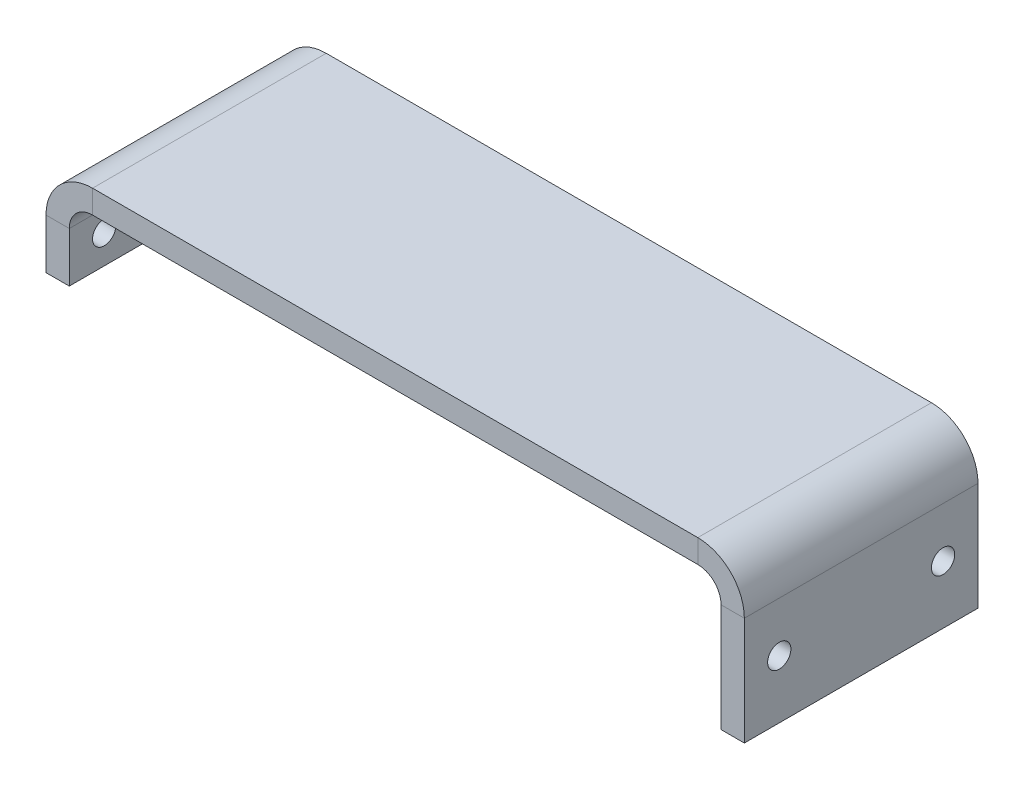
ISO-10303-21;
HEADER;
FILE_DESCRIPTION(('STEP AP214'),'2;1');
FILE_NAME('part.step','',(''),(''),'','','');
FILE_SCHEMA(('AUTOMOTIVE_DESIGN { 1 0 10303 214 1 1 1 1 }'));
ENDSEC;
DATA;
#1=APPLICATION_CONTEXT('core data for automotive mechanical design processes');
#2=APPLICATION_PROTOCOL_DEFINITION('international standard','automotive_design',2000,#1);
#3=PRODUCT_CONTEXT('',#1,'mechanical');
#4=PRODUCT('Part','Part','',(#3));
#5=PRODUCT_RELATED_PRODUCT_CATEGORY('part','',(#4));
#6=PRODUCT_DEFINITION_FORMATION('','',#4);
#7=PRODUCT_DEFINITION_CONTEXT('part definition',#1,'design');
#8=PRODUCT_DEFINITION('design','',#6,#7);
#9=PRODUCT_DEFINITION_SHAPE('','',#8);
#10=(LENGTH_UNIT() NAMED_UNIT(*) SI_UNIT(.MILLI.,.METRE.));
#11=(NAMED_UNIT(*) PLANE_ANGLE_UNIT() SI_UNIT($,.RADIAN.));
#12=(NAMED_UNIT(*) SI_UNIT($,.STERADIAN.) SOLID_ANGLE_UNIT());
#13=UNCERTAINTY_MEASURE_WITH_UNIT(LENGTH_MEASURE(1.E-05),#10,'distance_accuracy_value','');
#14=(GEOMETRIC_REPRESENTATION_CONTEXT(3) GLOBAL_UNCERTAINTY_ASSIGNED_CONTEXT((#13)) GLOBAL_UNIT_ASSIGNED_CONTEXT((#10,
#11,#12)) REPRESENTATION_CONTEXT('',''));
#15=CARTESIAN_POINT('',(0.,0.,0.));
#16=DIRECTION('',(0.,0.,1.));
#17=DIRECTION('',(1.,0.,0.));
#18=AXIS2_PLACEMENT_3D('',#15,#16,#17);
#19=CARTESIAN_POINT('',(-75.,-4.,20.075));
#20=DIRECTION('',(0.,0.,1.));
#21=DIRECTION('',(1.,0.,0.));
#22=AXIS2_PLACEMENT_3D('',#19,#20,#21);
#23=PLANE('',#22);
#24=DIRECTION('',(1.,0.,0.));
#25=VECTOR('',#24,1.);
#26=CARTESIAN_POINT('',(-75.,-4.,20.075));
#27=LINE('',#26,#25);
#28=CARTESIAN_POINT('',(-57.,-4.,20.075));
#29=VERTEX_POINT('',#28);
#30=CARTESIAN_POINT('',(47.,-4.,20.075));
#31=VERTEX_POINT('',#30);
#32=EDGE_CURVE('E218',#29,#31,#27,.T.);
#33=ORIENTED_EDGE('',*,*,#32,.T.);
#34=DIRECTION('',(0.,1.,0.));
#35=VECTOR('',#34,1.);
#36=CARTESIAN_POINT('',(47.,-4.,20.075));
#37=LINE('',#36,#35);
#38=CARTESIAN_POINT('',(47.,0.,20.075));
#39=VERTEX_POINT('',#38);
#40=EDGE_CURVE('E12',#31,#39,#37,.T.);
#41=ORIENTED_EDGE('',*,*,#40,.T.);
#42=DIRECTION('',(1.,0.,0.));
#43=VECTOR('',#42,1.);
#44=CARTESIAN_POINT('',(-75.,0.,20.075));
#45=LINE('',#44,#43);
#46=CARTESIAN_POINT('',(-57.,0.,20.075));
#47=VERTEX_POINT('',#46);
#48=EDGE_CURVE('E202',#47,#39,#45,.T.);
#49=ORIENTED_EDGE('',*,*,#48,.F.);
#50=DIRECTION('',(0.,1.,0.));
#51=VECTOR('',#50,1.);
#52=CARTESIAN_POINT('',(-57.,-4.,20.075));
#53=LINE('',#52,#51);
#54=EDGE_CURVE('E207',#29,#47,#53,.T.);
#55=ORIENTED_EDGE('',*,*,#54,.F.);
#56=EDGE_LOOP('',(#33,#41,#49,#55));
#57=FACE_BOUND('',#56,.T.);
#58=ADVANCED_FACE('F44',(#57),#23,.T.);
#59=CARTESIAN_POINT('',(-75.,-4.,-20.075));
#60=DIRECTION('',(0.,0.,-1.));
#61=DIRECTION('',(-1.,0.,0.));
#62=AXIS2_PLACEMENT_3D('',#59,#60,#61);
#63=PLANE('',#62);
#64=DIRECTION('',(-1.,0.,0.));
#65=VECTOR('',#64,1.);
#66=CARTESIAN_POINT('',(-75.,0.,-20.075));
#67=LINE('',#66,#65);
#68=CARTESIAN_POINT('',(47.,0.,-20.075));
#69=VERTEX_POINT('',#68);
#70=CARTESIAN_POINT('',(-57.,0.,-20.075));
#71=VERTEX_POINT('',#70);
#72=EDGE_CURVE('E203',#69,#71,#67,.T.);
#73=ORIENTED_EDGE('',*,*,#72,.F.);
#74=DIRECTION('',(0.,-1.,0.));
#75=VECTOR('',#74,1.);
#76=CARTESIAN_POINT('',(47.,-4.,-20.075));
#77=LINE('',#76,#75);
#78=CARTESIAN_POINT('',(47.,-4.,-20.075));
#79=VERTEX_POINT('',#78);
#80=EDGE_CURVE('E259',#69,#79,#77,.T.);
#81=ORIENTED_EDGE('',*,*,#80,.T.);
#82=DIRECTION('',(-1.,0.,0.));
#83=VECTOR('',#82,1.);
#84=CARTESIAN_POINT('',(-75.,-4.,-20.075));
#85=LINE('',#84,#83);
#86=CARTESIAN_POINT('',(-57.,-4.,-20.075));
#87=VERTEX_POINT('',#86);
#88=EDGE_CURVE('E47',#79,#87,#85,.T.);
#89=ORIENTED_EDGE('',*,*,#88,.T.);
#90=DIRECTION('',(0.,-1.,0.));
#91=VECTOR('',#90,1.);
#92=CARTESIAN_POINT('',(-57.,-4.,-20.075));
#93=LINE('',#92,#91);
#94=EDGE_CURVE('E204',#71,#87,#93,.T.);
#95=ORIENTED_EDGE('',*,*,#94,.F.);
#96=EDGE_LOOP('',(#73,#81,#89,#95));
#97=FACE_BOUND('',#96,.T.);
#98=ADVANCED_FACE('F272',(#97),#63,.T.);
#99=CARTESIAN_POINT('',(0.,-4.,0.));
#100=DIRECTION('',(0.,-1.,0.));
#101=DIRECTION('',(0.,0.,-1.));
#102=AXIS2_PLACEMENT_3D('',#99,#100,#101);
#103=PLANE('',#102);
#104=ORIENTED_EDGE('',*,*,#88,.F.);
#105=DIRECTION('',(0.,0.,1.));
#106=VECTOR('',#105,1.);
#107=CARTESIAN_POINT('',(47.,-4.,0.));
#108=LINE('',#107,#106);
#109=EDGE_CURVE('E250',#79,#31,#108,.T.);
#110=ORIENTED_EDGE('',*,*,#109,.T.);
#111=ORIENTED_EDGE('',*,*,#32,.F.);
#112=DIRECTION('',(0.,0.,1.));
#113=VECTOR('',#112,1.);
#114=CARTESIAN_POINT('',(-57.,-4.,0.));
#115=LINE('',#114,#113);
#116=EDGE_CURVE('E194',#87,#29,#115,.T.);
#117=ORIENTED_EDGE('',*,*,#116,.F.);
#118=EDGE_LOOP('',(#104,#110,#111,#117));
#119=FACE_BOUND('',#118,.T.);
#120=ADVANCED_FACE('F275',(#119),#103,.T.);
#121=CARTESIAN_POINT('',(-61.,-16.5752220392306,20.075));
#122=DIRECTION('',(0.,0.,1.));
#123=DIRECTION('',(0.,1.,0.));
#124=AXIS2_PLACEMENT_3D('',#121,#122,#123);
#125=PLANE('',#124);
#126=DIRECTION('',(0.,1.,0.));
#127=VECTOR('',#126,1.);
#128=CARTESIAN_POINT('',(-61.,-16.5752220392306,20.075));
#129=LINE('',#128,#127);
#130=CARTESIAN_POINT('',(-61.,-16.5752220392306,20.075));
#131=VERTEX_POINT('',#130);
#132=CARTESIAN_POINT('',(-61.,-8.00000000000001,20.075));
#133=VERTEX_POINT('',#132);
#134=EDGE_CURVE('E228',#131,#133,#129,.T.);
#135=ORIENTED_EDGE('',*,*,#134,.T.);
#136=DIRECTION('',(-1.,0.,0.));
#137=VECTOR('',#136,1.);
#138=CARTESIAN_POINT('',(-61.,-8.00000000000001,20.075));
#139=LINE('',#138,#137);
#140=CARTESIAN_POINT('',(-65.,-8.00000000000002,20.075));
#141=VERTEX_POINT('',#140);
#142=EDGE_CURVE('E247',#133,#141,#139,.T.);
#143=ORIENTED_EDGE('',*,*,#142,.T.);
#144=DIRECTION('',(0.,1.,0.));
#145=VECTOR('',#144,1.);
#146=CARTESIAN_POINT('',(-65.,-16.5752220392306,20.075));
#147=LINE('',#146,#145);
#148=CARTESIAN_POINT('',(-65.,-16.5752220392306,20.075));
#149=VERTEX_POINT('',#148);
#150=EDGE_CURVE('E233',#149,#141,#147,.T.);
#151=ORIENTED_EDGE('',*,*,#150,.F.);
#152=DIRECTION('',(-1.,0.,0.));
#153=VECTOR('',#152,1.);
#154=CARTESIAN_POINT('',(-61.,-16.5752220392306,20.075));
#155=LINE('',#154,#153);
#156=EDGE_CURVE('E234',#131,#149,#155,.T.);
#157=ORIENTED_EDGE('',*,*,#156,.F.);
#158=EDGE_LOOP('',(#135,#143,#151,#157));
#159=FACE_BOUND('',#158,.T.);
#160=ADVANCED_FACE('F288',(#159),#125,.T.);
#161=CARTESIAN_POINT('',(-61.,-16.5752220392306,-20.075));
#162=DIRECTION('',(0.,0.,-1.));
#163=DIRECTION('',(0.,-1.,0.));
#164=AXIS2_PLACEMENT_3D('',#161,#162,#163);
#165=PLANE('',#164);
#166=DIRECTION('',(0.,-1.,0.));
#167=VECTOR('',#166,1.);
#168=CARTESIAN_POINT('',(-65.,-16.5752220392306,-20.075));
#169=LINE('',#168,#167);
#170=CARTESIAN_POINT('',(-65.,-8.00000000000002,-20.075));
#171=VERTEX_POINT('',#170);
#172=CARTESIAN_POINT('',(-65.,-16.5752220392306,-20.075));
#173=VERTEX_POINT('',#172);
#174=EDGE_CURVE('E222',#171,#173,#169,.T.);
#175=ORIENTED_EDGE('',*,*,#174,.F.);
#176=DIRECTION('',(1.,0.,0.));
#177=VECTOR('',#176,1.);
#178=CARTESIAN_POINT('',(-61.,-8.00000000000001,-20.075));
#179=LINE('',#178,#177);
#180=CARTESIAN_POINT('',(-61.,-8.00000000000001,-20.075));
#181=VERTEX_POINT('',#180);
#182=EDGE_CURVE('E242',#171,#181,#179,.T.);
#183=ORIENTED_EDGE('',*,*,#182,.T.);
#184=DIRECTION('',(0.,-1.,0.));
#185=VECTOR('',#184,1.);
#186=CARTESIAN_POINT('',(-61.,-16.5752220392306,-20.075));
#187=LINE('',#186,#185);
#188=CARTESIAN_POINT('',(-61.,-16.5752220392306,-20.075));
#189=VERTEX_POINT('',#188);
#190=EDGE_CURVE('E229',#181,#189,#187,.T.);
#191=ORIENTED_EDGE('',*,*,#190,.T.);
#192=DIRECTION('',(-1.,0.,0.));
#193=VECTOR('',#192,1.);
#194=CARTESIAN_POINT('',(-61.,-16.5752220392306,-20.075));
#195=LINE('',#194,#193);
#196=EDGE_CURVE('E237',#189,#173,#195,.T.);
#197=ORIENTED_EDGE('',*,*,#196,.T.);
#198=EDGE_LOOP('',(#175,#183,#191,#197));
#199=FACE_BOUND('',#198,.T.);
#200=ADVANCED_FACE('F296',(#199),#165,.T.);
#201=CARTESIAN_POINT('',(-61.0000000000002,58.4247779607694,0.));
#202=DIRECTION('',(1.,0.,0.));
#203=DIRECTION('',(0.,0.,-1.));
#204=AXIS2_PLACEMENT_3D('',#201,#202,#203);
#205=PLANE('',#204);
#206=CARTESIAN_POINT('',(-61.,-11.5752220392306,-14.075));
#207=DIRECTION('',(-1.,0.,0.));
#208=DIRECTION('',(0.,0.,1.));
#209=AXIS2_PLACEMENT_3D('',#206,#207,#208);
#210=CIRCLE('',#209,2.);
#211=CARTESIAN_POINT('',(-61.,-11.5752220392306,-12.075));
#212=VERTEX_POINT('',#211);
#213=EDGE_CURVE('E219',#212,#212,#210,.T.);
#214=ORIENTED_EDGE('',*,*,#213,.T.);
#215=EDGE_LOOP('',(#214));
#216=FACE_BOUND('',#215,.T.);
#217=CARTESIAN_POINT('',(-61.,-11.5752220392306,14.075));
#218=DIRECTION('',(-1.,0.,0.));
#219=DIRECTION('',(0.,0.,-1.));
#220=AXIS2_PLACEMENT_3D('',#217,#218,#219);
#221=CIRCLE('',#220,2.);
#222=CARTESIAN_POINT('',(-61.,-11.5752220392306,12.075));
#223=VERTEX_POINT('',#222);
#224=EDGE_CURVE('E211',#223,#223,#221,.T.);
#225=ORIENTED_EDGE('',*,*,#224,.T.);
#226=EDGE_LOOP('',(#225));
#227=FACE_BOUND('',#226,.T.);
#228=ORIENTED_EDGE('',*,*,#190,.F.);
#229=DIRECTION('',(0.,0.,1.));
#230=VECTOR('',#229,1.);
#231=CARTESIAN_POINT('',(-61.,-8.00000000000001,0.));
#232=LINE('',#231,#230);
#233=EDGE_CURVE('E236',#181,#133,#232,.T.);
#234=ORIENTED_EDGE('',*,*,#233,.T.);
#235=ORIENTED_EDGE('',*,*,#134,.F.);
#236=DIRECTION('',(0.,0.,1.));
#237=VECTOR('',#236,1.);
#238=CARTESIAN_POINT('',(-61.,-16.5752220392306,20.075));
#239=LINE('',#238,#237);
#240=EDGE_CURVE('E225',#189,#131,#239,.T.);
#241=ORIENTED_EDGE('',*,*,#240,.F.);
#242=EDGE_LOOP('',(#228,#234,#235,#241));
#243=FACE_BOUND('',#242,.T.);
#244=ADVANCED_FACE('F285',(#216,#227,#243),#205,.T.);
#245=CARTESIAN_POINT('',(-61.,-16.5752220392306,20.075));
#246=DIRECTION('',(0.,-1.,0.));
#247=DIRECTION('',(0.,0.,1.));
#248=AXIS2_PLACEMENT_3D('',#245,#246,#247);
#249=PLANE('',#248);
#250=DIRECTION('',(0.,0.,1.));
#251=VECTOR('',#250,1.);
#252=CARTESIAN_POINT('',(-65.,-16.5752220392306,20.075));
#253=LINE('',#252,#251);
#254=EDGE_CURVE('E230',#173,#149,#253,.T.);
#255=ORIENTED_EDGE('',*,*,#254,.F.);
#256=ORIENTED_EDGE('',*,*,#196,.F.);
#257=ORIENTED_EDGE('',*,*,#240,.T.);
#258=ORIENTED_EDGE('',*,*,#156,.T.);
#259=EDGE_LOOP('',(#255,#256,#257,#258));
#260=FACE_BOUND('',#259,.T.);
#261=ADVANCED_FACE('F293',(#260),#249,.T.);
#262=CARTESIAN_POINT('',(-65.0000000000003,58.4247779607694,0.));
#263=DIRECTION('',(1.,0.,0.));
#264=DIRECTION('',(0.,0.,-1.));
#265=AXIS2_PLACEMENT_3D('',#262,#263,#264);
#266=PLANE('',#265);
#267=DIRECTION('',(0.,0.,1.));
#268=VECTOR('',#267,1.);
#269=CARTESIAN_POINT('',(-65.,-8.00000000000003,0.));
#270=LINE('',#269,#268);
#271=EDGE_CURVE('E245',#171,#141,#270,.T.);
#272=ORIENTED_EDGE('',*,*,#271,.F.);
#273=ORIENTED_EDGE('',*,*,#174,.T.);
#274=ORIENTED_EDGE('',*,*,#254,.T.);
#275=ORIENTED_EDGE('',*,*,#150,.T.);
#276=EDGE_LOOP('',(#272,#273,#274,#275));
#277=FACE_BOUND('',#276,.T.);
#278=CARTESIAN_POINT('',(-65.,-11.5752220392306,14.075));
#279=DIRECTION('',(-1.,0.,0.));
#280=DIRECTION('',(0.,0.,-1.));
#281=AXIS2_PLACEMENT_3D('',#278,#279,#280);
#282=CIRCLE('',#281,2.);
#283=CARTESIAN_POINT('',(-65.,-11.5752220392306,12.075));
#284=VERTEX_POINT('',#283);
#285=EDGE_CURVE('E215',#284,#284,#282,.T.);
#286=ORIENTED_EDGE('',*,*,#285,.F.);
#287=EDGE_LOOP('',(#286));
#288=FACE_BOUND('',#287,.T.);
#289=CARTESIAN_POINT('',(-65.,-11.5752220392306,-14.075));
#290=DIRECTION('',(-1.,0.,0.));
#291=DIRECTION('',(0.,0.,1.));
#292=AXIS2_PLACEMENT_3D('',#289,#290,#291);
#293=CIRCLE('',#292,2.);
#294=CARTESIAN_POINT('',(-65.,-11.5752220392306,-12.075));
#295=VERTEX_POINT('',#294);
#296=EDGE_CURVE('E214',#295,#295,#293,.T.);
#297=ORIENTED_EDGE('',*,*,#296,.F.);
#298=EDGE_LOOP('',(#297));
#299=FACE_BOUND('',#298,.T.);
#300=ADVANCED_FACE('F377',(#277,#288,#299),#266,.F.);
#301=CARTESIAN_POINT('',(-61.,-11.5752220392306,-14.075));
#302=DIRECTION('',(-1.,0.,0.));
#303=DIRECTION('',(0.,0.,1.));
#304=AXIS2_PLACEMENT_3D('',#301,#302,#303);
#305=CYLINDRICAL_SURFACE('',#304,2.);
#306=ORIENTED_EDGE('',*,*,#213,.F.);
#307=EDGE_LOOP('',(#306));
#308=FACE_BOUND('',#307,.T.);
#309=ORIENTED_EDGE('',*,*,#296,.T.);
#310=EDGE_LOOP('',(#309));
#311=FACE_BOUND('',#310,.T.);
#312=ADVANCED_FACE('F371',(#308,#311),#305,.F.);
#313=CARTESIAN_POINT('',(-61.,-11.5752220392306,14.075));
#314=DIRECTION('',(-1.,0.,0.));
#315=DIRECTION('',(0.,0.,1.));
#316=AXIS2_PLACEMENT_3D('',#313,#314,#315);
#317=CYLINDRICAL_SURFACE('',#316,2.);
#318=ORIENTED_EDGE('',*,*,#224,.F.);
#319=EDGE_LOOP('',(#318));
#320=FACE_BOUND('',#319,.T.);
#321=ORIENTED_EDGE('',*,*,#285,.T.);
#322=EDGE_LOOP('',(#321));
#323=FACE_BOUND('',#322,.T.);
#324=ADVANCED_FACE('F365',(#320,#323),#317,.F.);
#325=CARTESIAN_POINT('',(0.,0.,0.));
#326=DIRECTION('',(0.,-1.,0.));
#327=DIRECTION('',(0.,0.,-1.));
#328=AXIS2_PLACEMENT_3D('',#325,#326,#327);
#329=PLANE('',#328);
#330=DIRECTION('',(0.,0.,1.));
#331=VECTOR('',#330,1.);
#332=CARTESIAN_POINT('',(47.,0.,0.));
#333=LINE('',#332,#331);
#334=EDGE_CURVE('E52',#69,#39,#333,.T.);
#335=ORIENTED_EDGE('',*,*,#334,.F.);
#336=ORIENTED_EDGE('',*,*,#72,.T.);
#337=DIRECTION('',(0.,0.,1.));
#338=VECTOR('',#337,1.);
#339=CARTESIAN_POINT('',(-57.,0.,0.));
#340=LINE('',#339,#338);
#341=EDGE_CURVE('E199',#71,#47,#340,.T.);
#342=ORIENTED_EDGE('',*,*,#341,.T.);
#343=ORIENTED_EDGE('',*,*,#48,.T.);
#344=EDGE_LOOP('',(#335,#336,#342,#343));
#345=FACE_BOUND('',#344,.T.);
#346=ADVANCED_FACE('F301',(#345),#329,.F.);
#347=CARTESIAN_POINT('',(-57.,-8.,-20.075));
#348=DIRECTION('',(0.,0.,1.));
#349=DIRECTION('',(1.,0.,0.));
#350=AXIS2_PLACEMENT_3D('',#347,#348,#349);
#351=PLANE('',#350);
#352=ORIENTED_EDGE('',*,*,#182,.F.);
#353=CARTESIAN_POINT('',(-57.,-8.,-20.075));
#354=DIRECTION('',(0.,0.,-1.));
#355=DIRECTION('',(-1.,0.,0.));
#356=AXIS2_PLACEMENT_3D('',#353,#354,#355);
#357=CIRCLE('',#356,8.);
#358=EDGE_CURVE('E185',#171,#71,#357,.T.);
#359=ORIENTED_EDGE('',*,*,#358,.T.);
#360=ORIENTED_EDGE('',*,*,#94,.T.);
#361=CARTESIAN_POINT('',(-57.,-8.,-20.075));
#362=DIRECTION('',(0.,0.,-1.));
#363=DIRECTION('',(1.,0.,0.));
#364=AXIS2_PLACEMENT_3D('',#361,#362,#363);
#365=CIRCLE('',#364,4.);
#366=EDGE_CURVE('E189',#181,#87,#365,.T.);
#367=ORIENTED_EDGE('',*,*,#366,.F.);
#368=EDGE_LOOP('',(#352,#359,#360,#367));
#369=FACE_BOUND('',#368,.T.);
#370=ADVANCED_FACE('F279',(#369),#351,.F.);
#371=CARTESIAN_POINT('',(-57.,-8.,20.075));
#372=DIRECTION('',(0.,0.,-1.));
#373=DIRECTION('',(-1.,0.,0.));
#374=AXIS2_PLACEMENT_3D('',#371,#372,#373);
#375=PLANE('',#374);
#376=CARTESIAN_POINT('',(-57.,-8.,20.075));
#377=DIRECTION('',(0.,0.,-1.));
#378=DIRECTION('',(-1.,0.,0.));
#379=AXIS2_PLACEMENT_3D('',#376,#377,#378);
#380=CIRCLE('',#379,8.);
#381=EDGE_CURVE('E192',#47,#141,#380,.F.);
#382=ORIENTED_EDGE('',*,*,#381,.T.);
#383=ORIENTED_EDGE('',*,*,#142,.F.);
#384=CARTESIAN_POINT('',(-57.,-8.,20.075));
#385=DIRECTION('',(0.,0.,1.));
#386=DIRECTION('',(-1.,0.,0.));
#387=AXIS2_PLACEMENT_3D('',#384,#385,#386);
#388=CIRCLE('',#387,4.);
#389=EDGE_CURVE('E67',#29,#133,#388,.T.);
#390=ORIENTED_EDGE('',*,*,#389,.F.);
#391=ORIENTED_EDGE('',*,*,#54,.T.);
#392=EDGE_LOOP('',(#382,#383,#390,#391));
#393=FACE_BOUND('',#392,.T.);
#394=ADVANCED_FACE('F303',(#393),#375,.F.);
#395=CARTESIAN_POINT('',(-57.,-8.,41.4348758850537));
#396=DIRECTION('',(0.,0.,-1.));
#397=DIRECTION('',(-1.,0.,0.));
#398=AXIS2_PLACEMENT_3D('',#395,#396,#397);
#399=CYLINDRICAL_SURFACE('',#398,4.);
#400=ORIENTED_EDGE('',*,*,#116,.T.);
#401=ORIENTED_EDGE('',*,*,#389,.T.);
#402=ORIENTED_EDGE('',*,*,#233,.F.);
#403=ORIENTED_EDGE('',*,*,#366,.T.);
#404=EDGE_LOOP('',(#400,#401,#402,#403));
#405=FACE_BOUND('',#404,.T.);
#406=ADVANCED_FACE('F282',(#405),#399,.F.);
#407=CARTESIAN_POINT('',(-57.,-8.,41.4348758850537));
#408=DIRECTION('',(0.,0.,-1.));
#409=DIRECTION('',(-1.,0.,0.));
#410=AXIS2_PLACEMENT_3D('',#407,#408,#409);
#411=CYLINDRICAL_SURFACE('',#410,8.);
#412=ORIENTED_EDGE('',*,*,#341,.F.);
#413=ORIENTED_EDGE('',*,*,#358,.F.);
#414=ORIENTED_EDGE('',*,*,#271,.T.);
#415=ORIENTED_EDGE('',*,*,#381,.F.);
#416=EDGE_LOOP('',(#412,#413,#414,#415));
#417=FACE_BOUND('',#416,.T.);
#418=ADVANCED_FACE('F299',(#417),#411,.T.);
#419=CARTESIAN_POINT('',(47.,-8.,-20.075));
#420=DIRECTION('',(0.,0.,1.));
#421=DIRECTION('',(1.,0.,0.));
#422=AXIS2_PLACEMENT_3D('',#419,#420,#421);
#423=PLANE('',#422);
#424=ORIENTED_EDGE('',*,*,#80,.F.);
#425=CARTESIAN_POINT('',(47.,-8.,-20.075));
#426=DIRECTION('',(0.,0.,1.));
#427=DIRECTION('',(1.,0.,0.));
#428=AXIS2_PLACEMENT_3D('',#425,#426,#427);
#429=CIRCLE('',#428,8.);
#430=CARTESIAN_POINT('',(55.,-8.00000000000003,-20.075));
#431=VERTEX_POINT('',#430);
#432=EDGE_CURVE('E153',#69,#431,#429,.F.);
#433=ORIENTED_EDGE('',*,*,#432,.T.);
#434=DIRECTION('',(-1.,0.,0.));
#435=VECTOR('',#434,1.);
#436=CARTESIAN_POINT('',(51.,-8.00000000000001,-20.075));
#437=LINE('',#436,#435);
#438=CARTESIAN_POINT('',(51.,-8.00000000000001,-20.075));
#439=VERTEX_POINT('',#438);
#440=EDGE_CURVE('E172',#431,#439,#437,.T.);
#441=ORIENTED_EDGE('',*,*,#440,.T.);
#442=CARTESIAN_POINT('',(47.,-8.,-20.075));
#443=DIRECTION('',(0.,0.,-1.));
#444=DIRECTION('',(1.,0.,0.));
#445=AXIS2_PLACEMENT_3D('',#442,#443,#444);
#446=CIRCLE('',#445,4.);
#447=EDGE_CURVE('E178',#79,#439,#446,.T.);
#448=ORIENTED_EDGE('',*,*,#447,.F.);
#449=EDGE_LOOP('',(#424,#433,#441,#448));
#450=FACE_BOUND('',#449,.T.);
#451=ADVANCED_FACE('F320',(#450),#423,.F.);
#452=CARTESIAN_POINT('',(47.,-8.,20.075));
#453=DIRECTION('',(0.,0.,-1.));
#454=DIRECTION('',(-1.,0.,0.));
#455=AXIS2_PLACEMENT_3D('',#452,#453,#454);
#456=PLANE('',#455);
#457=DIRECTION('',(1.,0.,0.));
#458=VECTOR('',#457,1.);
#459=CARTESIAN_POINT('',(51.,-8.00000000000001,20.075));
#460=LINE('',#459,#458);
#461=CARTESIAN_POINT('',(51.,-8.00000000000002,20.075));
#462=VERTEX_POINT('',#461);
#463=CARTESIAN_POINT('',(55.,-8.00000000000003,20.075));
#464=VERTEX_POINT('',#463);
#465=EDGE_CURVE('E142',#462,#464,#460,.T.);
#466=ORIENTED_EDGE('',*,*,#465,.T.);
#467=CARTESIAN_POINT('',(47.,-8.,20.075));
#468=DIRECTION('',(0.,0.,1.));
#469=DIRECTION('',(1.,0.,0.));
#470=AXIS2_PLACEMENT_3D('',#467,#468,#469);
#471=CIRCLE('',#470,8.);
#472=EDGE_CURVE('E182',#464,#39,#471,.T.);
#473=ORIENTED_EDGE('',*,*,#472,.T.);
#474=ORIENTED_EDGE('',*,*,#40,.F.);
#475=CARTESIAN_POINT('',(47.,-8.,20.075));
#476=DIRECTION('',(0.,0.,1.));
#477=DIRECTION('',(-1.,0.,0.));
#478=AXIS2_PLACEMENT_3D('',#475,#476,#477);
#479=CIRCLE('',#478,4.);
#480=EDGE_CURVE('E181',#462,#31,#479,.T.);
#481=ORIENTED_EDGE('',*,*,#480,.F.);
#482=EDGE_LOOP('',(#466,#473,#474,#481));
#483=FACE_BOUND('',#482,.T.);
#484=ADVANCED_FACE('F307',(#483),#456,.F.);
#485=CARTESIAN_POINT('',(47.,-8.,-41.4348758850537));
#486=DIRECTION('',(0.,0.,1.));
#487=DIRECTION('',(1.,0.,0.));
#488=AXIS2_PLACEMENT_3D('',#485,#486,#487);
#489=CYLINDRICAL_SURFACE('',#488,4.);
#490=ORIENTED_EDGE('',*,*,#480,.T.);
#491=ORIENTED_EDGE('',*,*,#109,.F.);
#492=ORIENTED_EDGE('',*,*,#447,.T.);
#493=DIRECTION('',(0.,0.,1.));
#494=VECTOR('',#493,1.);
#495=CARTESIAN_POINT('',(51.,-8.00000000000001,0.));
#496=LINE('',#495,#494);
#497=EDGE_CURVE('E176',#439,#462,#496,.T.);
#498=ORIENTED_EDGE('',*,*,#497,.T.);
#499=EDGE_LOOP('',(#490,#491,#492,#498));
#500=FACE_BOUND('',#499,.T.);
#501=ADVANCED_FACE('F310',(#500),#489,.F.);
#502=CARTESIAN_POINT('',(47.,-8.,-41.4348758850537));
#503=DIRECTION('',(0.,0.,1.));
#504=DIRECTION('',(1.,0.,0.));
#505=AXIS2_PLACEMENT_3D('',#502,#503,#504);
#506=CYLINDRICAL_SURFACE('',#505,8.);
#507=ORIENTED_EDGE('',*,*,#472,.F.);
#508=DIRECTION('',(0.,0.,1.));
#509=VECTOR('',#508,1.);
#510=CARTESIAN_POINT('',(55.,-8.00000000000003,0.));
#511=LINE('',#510,#509);
#512=EDGE_CURVE('E323',#431,#464,#511,.T.);
#513=ORIENTED_EDGE('',*,*,#512,.F.);
#514=ORIENTED_EDGE('',*,*,#432,.F.);
#515=ORIENTED_EDGE('',*,*,#334,.T.);
#516=EDGE_LOOP('',(#507,#513,#514,#515));
#517=FACE_BOUND('',#516,.T.);
#518=ADVANCED_FACE('F321',(#517),#506,.T.);
#519=CARTESIAN_POINT('',(51.,-16.5752220392306,-14.075));
#520=DIRECTION('',(1.,0.,0.));
#521=DIRECTION('',(0.,0.,1.));
#522=AXIS2_PLACEMENT_3D('',#519,#520,#521);
#523=CYLINDRICAL_SURFACE('',#522,2.);
#524=CARTESIAN_POINT('',(51.,-16.5752220392306,-14.075));
#525=DIRECTION('',(1.,0.,0.));
#526=DIRECTION('',(0.,0.,1.));
#527=AXIS2_PLACEMENT_3D('',#524,#525,#526);
#528=CIRCLE('',#527,2.);
#529=CARTESIAN_POINT('',(51.,-16.5752220392306,-12.075));
#530=VERTEX_POINT('',#529);
#531=EDGE_CURVE('E317',#530,#530,#528,.T.);
#532=ORIENTED_EDGE('',*,*,#531,.F.);
#533=EDGE_LOOP('',(#532));
#534=FACE_BOUND('',#533,.T.);
#535=CARTESIAN_POINT('',(55.,-16.5752220392306,-14.075));
#536=DIRECTION('',(1.,0.,0.));
#537=DIRECTION('',(0.,0.,1.));
#538=AXIS2_PLACEMENT_3D('',#535,#536,#537);
#539=CIRCLE('',#538,2.);
#540=CARTESIAN_POINT('',(55.,-16.5752220392306,-12.075));
#541=VERTEX_POINT('',#540);
#542=EDGE_CURVE('E166',#541,#541,#539,.T.);
#543=ORIENTED_EDGE('',*,*,#542,.T.);
#544=EDGE_LOOP('',(#543));
#545=FACE_BOUND('',#544,.T.);
#546=ADVANCED_FACE('F339',(#534,#545),#523,.F.);
#547=CARTESIAN_POINT('',(51.,-16.5752220392306,14.075));
#548=DIRECTION('',(1.,0.,0.));
#549=DIRECTION('',(0.,0.,1.));
#550=AXIS2_PLACEMENT_3D('',#547,#548,#549);
#551=CYLINDRICAL_SURFACE('',#550,2.);
#552=CARTESIAN_POINT('',(51.,-16.5752220392306,14.075));
#553=DIRECTION('',(1.,0.,0.));
#554=DIRECTION('',(0.,0.,-1.));
#555=AXIS2_PLACEMENT_3D('',#552,#553,#554);
#556=CIRCLE('',#555,2.);
#557=CARTESIAN_POINT('',(51.,-16.5752220392306,12.075));
#558=VERTEX_POINT('',#557);
#559=EDGE_CURVE('E163',#558,#558,#556,.T.);
#560=ORIENTED_EDGE('',*,*,#559,.F.);
#561=EDGE_LOOP('',(#560));
#562=FACE_BOUND('',#561,.T.);
#563=CARTESIAN_POINT('',(55.,-16.5752220392306,14.075));
#564=DIRECTION('',(1.,0.,0.));
#565=DIRECTION('',(0.,0.,-1.));
#566=AXIS2_PLACEMENT_3D('',#563,#564,#565);
#567=CIRCLE('',#566,2.);
#568=CARTESIAN_POINT('',(55.,-16.5752220392306,12.075));
#569=VERTEX_POINT('',#568);
#570=EDGE_CURVE('E161',#569,#569,#567,.T.);
#571=ORIENTED_EDGE('',*,*,#570,.T.);
#572=EDGE_LOOP('',(#571));
#573=FACE_BOUND('',#572,.T.);
#574=ADVANCED_FACE('F336',(#562,#573),#551,.F.);
#575=CARTESIAN_POINT('',(50.9999999999999,-26.5752220392306,20.075));
#576=DIRECTION('',(0.,-1.,0.));
#577=DIRECTION('',(0.,0.,-1.));
#578=AXIS2_PLACEMENT_3D('',#575,#576,#577);
#579=PLANE('',#578);
#580=DIRECTION('',(0.,0.,-1.));
#581=VECTOR('',#580,1.);
#582=CARTESIAN_POINT('',(54.9999999999999,-26.5752220392306,20.075));
#583=LINE('',#582,#581);
#584=CARTESIAN_POINT('',(54.9999999999999,-26.5752220392306,20.075));
#585=VERTEX_POINT('',#584);
#586=CARTESIAN_POINT('',(55.,-26.5752220392306,-20.075));
#587=VERTEX_POINT('',#586);
#588=EDGE_CURVE('E146',#585,#587,#583,.T.);
#589=ORIENTED_EDGE('',*,*,#588,.F.);
#590=DIRECTION('',(1.,0.,0.));
#591=VECTOR('',#590,1.);
#592=CARTESIAN_POINT('',(50.9999999999999,-26.5752220392306,20.075));
#593=LINE('',#592,#591);
#594=CARTESIAN_POINT('',(50.9999999999999,-26.5752220392306,20.075));
#595=VERTEX_POINT('',#594);
#596=EDGE_CURVE('E139',#595,#585,#593,.T.);
#597=ORIENTED_EDGE('',*,*,#596,.F.);
#598=DIRECTION('',(0.,0.,-1.));
#599=VECTOR('',#598,1.);
#600=CARTESIAN_POINT('',(50.9999999999999,-26.5752220392306,20.075));
#601=LINE('',#600,#599);
#602=CARTESIAN_POINT('',(51.,-26.5752220392306,-20.075));
#603=VERTEX_POINT('',#602);
#604=EDGE_CURVE('E151',#595,#603,#601,.T.);
#605=ORIENTED_EDGE('',*,*,#604,.T.);
#606=DIRECTION('',(1.,0.,0.));
#607=VECTOR('',#606,1.);
#608=CARTESIAN_POINT('',(51.,-26.5752220392306,-20.075));
#609=LINE('',#608,#607);
#610=EDGE_CURVE('E160',#603,#587,#609,.T.);
#611=ORIENTED_EDGE('',*,*,#610,.T.);
#612=EDGE_LOOP('',(#589,#597,#605,#611));
#613=FACE_BOUND('',#612,.T.);
#614=ADVANCED_FACE('F150',(#613),#579,.T.);
#615=CARTESIAN_POINT('',(51.0000000000002,48.4247779607694,0.));
#616=DIRECTION('',(-1.,0.,0.));
#617=DIRECTION('',(0.,0.,-1.));
#618=AXIS2_PLACEMENT_3D('',#615,#616,#617);
#619=PLANE('',#618);
#620=ORIENTED_EDGE('',*,*,#497,.F.);
#621=DIRECTION('',(0.,1.,0.));
#622=VECTOR('',#621,1.);
#623=CARTESIAN_POINT('',(51.0000000000005,123.424777960769,-20.0749999999999));
#624=LINE('',#623,#622);
#625=EDGE_CURVE('E159',#603,#439,#624,.T.);
#626=ORIENTED_EDGE('',*,*,#625,.F.);
#627=ORIENTED_EDGE('',*,*,#604,.F.);
#628=DIRECTION('',(0.,-1.,0.));
#629=VECTOR('',#628,1.);
#630=CARTESIAN_POINT('',(51.0000000000005,123.424777960769,20.0750000000001));
#631=LINE('',#630,#629);
#632=EDGE_CURVE('E136',#462,#595,#631,.T.);
#633=ORIENTED_EDGE('',*,*,#632,.F.);
#634=EDGE_LOOP('',(#620,#626,#627,#633));
#635=FACE_BOUND('',#634,.T.);
#636=ORIENTED_EDGE('',*,*,#559,.T.);
#637=EDGE_LOOP('',(#636));
#638=FACE_BOUND('',#637,.T.);
#639=ORIENTED_EDGE('',*,*,#531,.T.);
#640=EDGE_LOOP('',(#639));
#641=FACE_BOUND('',#640,.T.);
#642=ADVANCED_FACE('F156',(#635,#638,#641),#619,.T.);
#643=CARTESIAN_POINT('',(51.0000000000005,123.424777960769,-20.0749999999999));
#644=DIRECTION('',(0.,0.,-1.));
#645=DIRECTION('',(0.,1.,0.));
#646=AXIS2_PLACEMENT_3D('',#643,#644,#645);
#647=PLANE('',#646);
#648=ORIENTED_EDGE('',*,*,#440,.F.);
#649=DIRECTION('',(0.,1.,0.));
#650=VECTOR('',#649,1.);
#651=CARTESIAN_POINT('',(55.0000000000005,123.424777960769,-20.0749999999999));
#652=LINE('',#651,#650);
#653=EDGE_CURVE('E316',#587,#431,#652,.T.);
#654=ORIENTED_EDGE('',*,*,#653,.F.);
#655=ORIENTED_EDGE('',*,*,#610,.F.);
#656=ORIENTED_EDGE('',*,*,#625,.T.);
#657=EDGE_LOOP('',(#648,#654,#655,#656));
#658=FACE_BOUND('',#657,.T.);
#659=ADVANCED_FACE('F313',(#658),#647,.T.);
#660=CARTESIAN_POINT('',(55.0000000000002,48.4247779607694,0.));
#661=DIRECTION('',(-1.,0.,0.));
#662=DIRECTION('',(0.,0.,-1.));
#663=AXIS2_PLACEMENT_3D('',#660,#661,#662);
#664=PLANE('',#663);
#665=ORIENTED_EDGE('',*,*,#542,.F.);
#666=EDGE_LOOP('',(#665));
#667=FACE_BOUND('',#666,.T.);
#668=ORIENTED_EDGE('',*,*,#570,.F.);
#669=EDGE_LOOP('',(#668));
#670=FACE_BOUND('',#669,.T.);
#671=ORIENTED_EDGE('',*,*,#653,.T.);
#672=ORIENTED_EDGE('',*,*,#512,.T.);
#673=DIRECTION('',(0.,-1.,0.));
#674=VECTOR('',#673,1.);
#675=CARTESIAN_POINT('',(55.0000000000005,123.424777960769,20.0750000000001));
#676=LINE('',#675,#674);
#677=EDGE_CURVE('E325',#464,#585,#676,.T.);
#678=ORIENTED_EDGE('',*,*,#677,.T.);
#679=ORIENTED_EDGE('',*,*,#588,.T.);
#680=EDGE_LOOP('',(#671,#672,#678,#679));
#681=FACE_BOUND('',#680,.T.);
#682=ADVANCED_FACE('F343',(#667,#670,#681),#664,.F.);
#683=CARTESIAN_POINT('',(51.0000000000005,123.424777960769,20.0750000000001));
#684=DIRECTION('',(0.,0.,1.));
#685=DIRECTION('',(0.,-1.,0.));
#686=AXIS2_PLACEMENT_3D('',#683,#684,#685);
#687=PLANE('',#686);
#688=ORIENTED_EDGE('',*,*,#465,.F.);
#689=ORIENTED_EDGE('',*,*,#632,.T.);
#690=ORIENTED_EDGE('',*,*,#596,.T.);
#691=ORIENTED_EDGE('',*,*,#677,.F.);
#692=EDGE_LOOP('',(#688,#689,#690,#691));
#693=FACE_BOUND('',#692,.T.);
#694=ADVANCED_FACE('F138',(#693),#687,.T.);
#695=CLOSED_SHELL('',(#58,#98,#120,#160,#200,#244,#261,#300,#312,#324,#346,#370,#394,#406,#418,
#451,#484,#501,#518,#546,#574,#614,#642,#659,#682,#694));
#696=MANIFOLD_SOLID_BREP('B2',#695);
#697=ADVANCED_BREP_SHAPE_REPRESENTATION('',(#18,#696),#14);
#698=SHAPE_DEFINITION_REPRESENTATION(#9,#697);
ENDSEC;
END-ISO-10303-21;
